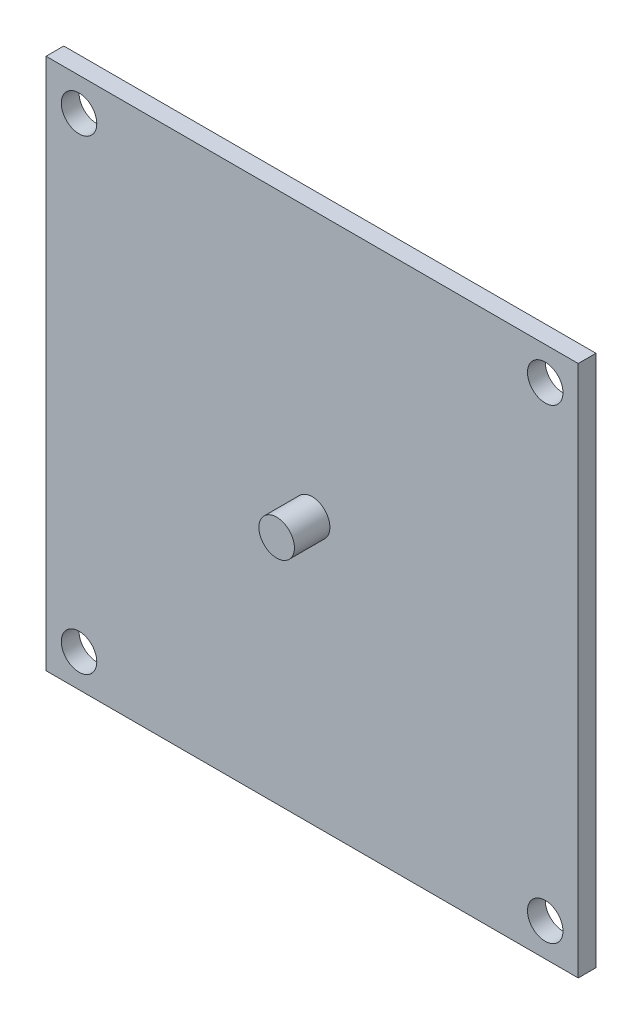
ISO-10303-21;
HEADER;
FILE_DESCRIPTION(('STEP AP214'),'2;1');
FILE_NAME('part.step','',(''),(''),'','','');
FILE_SCHEMA(('AUTOMOTIVE_DESIGN { 1 0 10303 214 1 1 1 1 }'));
ENDSEC;
DATA;
#1=APPLICATION_CONTEXT('core data for automotive mechanical design processes');
#2=APPLICATION_PROTOCOL_DEFINITION('international standard','automotive_design',2000,#1);
#3=PRODUCT_CONTEXT('',#1,'mechanical');
#4=PRODUCT('Part','Part','',(#3));
#5=PRODUCT_RELATED_PRODUCT_CATEGORY('part','',(#4));
#6=PRODUCT_DEFINITION_FORMATION('','',#4);
#7=PRODUCT_DEFINITION_CONTEXT('part definition',#1,'design');
#8=PRODUCT_DEFINITION('design','',#6,#7);
#9=PRODUCT_DEFINITION_SHAPE('','',#8);
#10=(LENGTH_UNIT() NAMED_UNIT(*) SI_UNIT(.MILLI.,.METRE.));
#11=(NAMED_UNIT(*) PLANE_ANGLE_UNIT() SI_UNIT($,.RADIAN.));
#12=(NAMED_UNIT(*) SI_UNIT($,.STERADIAN.) SOLID_ANGLE_UNIT());
#13=UNCERTAINTY_MEASURE_WITH_UNIT(LENGTH_MEASURE(1.E-05),#10,'distance_accuracy_value','');
#14=(GEOMETRIC_REPRESENTATION_CONTEXT(3) GLOBAL_UNCERTAINTY_ASSIGNED_CONTEXT((#13)) GLOBAL_UNIT_ASSIGNED_CONTEXT((#10,
#11,#12)) REPRESENTATION_CONTEXT('',''));
#15=CARTESIAN_POINT('',(0.,0.,0.));
#16=DIRECTION('',(0.,0.,1.));
#17=DIRECTION('',(1.,0.,0.));
#18=AXIS2_PLACEMENT_3D('',#15,#16,#17);
#19=CARTESIAN_POINT('',(15.,15.,1.));
#20=DIRECTION('',(-1.,0.,0.));
#21=DIRECTION('',(0.,-1.,0.));
#22=AXIS2_PLACEMENT_3D('',#19,#20,#21);
#23=PLANE('',#22);
#24=DIRECTION('',(0.,1.,0.));
#25=VECTOR('',#24,1.);
#26=CARTESIAN_POINT('',(15.,15.,0.));
#27=LINE('',#26,#25);
#28=CARTESIAN_POINT('',(15.,-15.,0.));
#29=VERTEX_POINT('',#28);
#30=CARTESIAN_POINT('',(15.,15.,0.));
#31=VERTEX_POINT('',#30);
#32=EDGE_CURVE('E97',#29,#31,#27,.T.);
#33=ORIENTED_EDGE('',*,*,#32,.T.);
#34=DIRECTION('',(0.,0.,-1.));
#35=VECTOR('',#34,1.);
#36=CARTESIAN_POINT('',(15.,15.,1.));
#37=LINE('',#36,#35);
#38=CARTESIAN_POINT('',(15.,15.,1.));
#39=VERTEX_POINT('',#38);
#40=EDGE_CURVE('E11',#39,#31,#37,.T.);
#41=ORIENTED_EDGE('',*,*,#40,.F.);
#42=DIRECTION('',(0.,1.,0.));
#43=VECTOR('',#42,1.);
#44=CARTESIAN_POINT('',(15.,15.,1.));
#45=LINE('',#44,#43);
#46=CARTESIAN_POINT('',(15.,-15.,1.));
#47=VERTEX_POINT('',#46);
#48=EDGE_CURVE('E85',#47,#39,#45,.T.);
#49=ORIENTED_EDGE('',*,*,#48,.F.);
#50=DIRECTION('',(0.,0.,-1.));
#51=VECTOR('',#50,1.);
#52=CARTESIAN_POINT('',(15.,-15.,1.));
#53=LINE('',#52,#51);
#54=EDGE_CURVE('E93',#47,#29,#53,.T.);
#55=ORIENTED_EDGE('',*,*,#54,.T.);
#56=EDGE_LOOP('',(#33,#41,#49,#55));
#57=FACE_BOUND('',#56,.T.);
#58=ADVANCED_FACE('F34',(#57),#23,.F.);
#59=CARTESIAN_POINT('',(-15.,15.,1.));
#60=DIRECTION('',(0.,-1.,0.));
#61=DIRECTION('',(0.,0.,-1.));
#62=AXIS2_PLACEMENT_3D('',#59,#60,#61);
#63=PLANE('',#62);
#64=DIRECTION('',(-1.,0.,0.));
#65=VECTOR('',#64,1.);
#66=CARTESIAN_POINT('',(-15.,15.,0.));
#67=LINE('',#66,#65);
#68=CARTESIAN_POINT('',(-15.,15.,0.));
#69=VERTEX_POINT('',#68);
#70=EDGE_CURVE('E89',#31,#69,#67,.T.);
#71=ORIENTED_EDGE('',*,*,#70,.T.);
#72=DIRECTION('',(0.,0.,-1.));
#73=VECTOR('',#72,1.);
#74=CARTESIAN_POINT('',(-15.,15.,1.));
#75=LINE('',#74,#73);
#76=CARTESIAN_POINT('',(-15.,15.,1.));
#77=VERTEX_POINT('',#76);
#78=EDGE_CURVE('E42',#77,#69,#75,.T.);
#79=ORIENTED_EDGE('',*,*,#78,.F.);
#80=DIRECTION('',(-1.,0.,0.));
#81=VECTOR('',#80,1.);
#82=CARTESIAN_POINT('',(-15.,15.,1.));
#83=LINE('',#82,#81);
#84=EDGE_CURVE('E80',#39,#77,#83,.T.);
#85=ORIENTED_EDGE('',*,*,#84,.F.);
#86=ORIENTED_EDGE('',*,*,#40,.T.);
#87=EDGE_LOOP('',(#71,#79,#85,#86));
#88=FACE_BOUND('',#87,.T.);
#89=ADVANCED_FACE('F88',(#88),#63,.F.);
#90=CARTESIAN_POINT('',(-15.,15.,1.));
#91=DIRECTION('',(1.,0.,0.));
#92=DIRECTION('',(0.,1.,0.));
#93=AXIS2_PLACEMENT_3D('',#90,#91,#92);
#94=PLANE('',#93);
#95=DIRECTION('',(0.,-1.,0.));
#96=VECTOR('',#95,1.);
#97=CARTESIAN_POINT('',(-15.,15.,0.));
#98=LINE('',#97,#96);
#99=CARTESIAN_POINT('',(-15.,-15.,0.));
#100=VERTEX_POINT('',#99);
#101=EDGE_CURVE('E67',#69,#100,#98,.T.);
#102=ORIENTED_EDGE('',*,*,#101,.T.);
#103=DIRECTION('',(0.,0.,-1.));
#104=VECTOR('',#103,1.);
#105=CARTESIAN_POINT('',(-15.,-15.,1.));
#106=LINE('',#105,#104);
#107=CARTESIAN_POINT('',(-15.,-15.,1.));
#108=VERTEX_POINT('',#107);
#109=EDGE_CURVE('E90',#108,#100,#106,.T.);
#110=ORIENTED_EDGE('',*,*,#109,.F.);
#111=DIRECTION('',(0.,-1.,0.));
#112=VECTOR('',#111,1.);
#113=CARTESIAN_POINT('',(-15.,15.,1.));
#114=LINE('',#113,#112);
#115=EDGE_CURVE('E83',#77,#108,#114,.T.);
#116=ORIENTED_EDGE('',*,*,#115,.F.);
#117=ORIENTED_EDGE('',*,*,#78,.T.);
#118=EDGE_LOOP('',(#102,#110,#116,#117));
#119=FACE_BOUND('',#118,.T.);
#120=ADVANCED_FACE('F91',(#119),#94,.F.);
#121=CARTESIAN_POINT('',(-15.,-15.,1.));
#122=DIRECTION('',(0.,1.,0.));
#123=DIRECTION('',(0.,0.,1.));
#124=AXIS2_PLACEMENT_3D('',#121,#122,#123);
#125=PLANE('',#124);
#126=DIRECTION('',(1.,0.,0.));
#127=VECTOR('',#126,1.);
#128=CARTESIAN_POINT('',(-15.,-15.,0.));
#129=LINE('',#128,#127);
#130=EDGE_CURVE('E73',#100,#29,#129,.T.);
#131=ORIENTED_EDGE('',*,*,#130,.T.);
#132=ORIENTED_EDGE('',*,*,#54,.F.);
#133=DIRECTION('',(1.,0.,0.));
#134=VECTOR('',#133,1.);
#135=CARTESIAN_POINT('',(-15.,-15.,1.));
#136=LINE('',#135,#134);
#137=EDGE_CURVE('E50',#108,#47,#136,.T.);
#138=ORIENTED_EDGE('',*,*,#137,.F.);
#139=ORIENTED_EDGE('',*,*,#109,.T.);
#140=EDGE_LOOP('',(#131,#132,#138,#139));
#141=FACE_BOUND('',#140,.T.);
#142=ADVANCED_FACE('F105',(#141),#125,.F.);
#143=CARTESIAN_POINT('',(0.,0.,1.));
#144=DIRECTION('',(0.,0.,1.));
#145=DIRECTION('',(1.,0.,0.));
#146=AXIS2_PLACEMENT_3D('',#143,#144,#145);
#147=PLANE('',#146);
#148=CARTESIAN_POINT('',(0.,0.,1.));
#149=DIRECTION('',(0.,0.,1.));
#150=DIRECTION('',(1.,0.,0.));
#151=AXIS2_PLACEMENT_3D('',#148,#149,#150);
#152=CIRCLE('',#151,1.);
#153=CARTESIAN_POINT('',(1.,0.,1.));
#154=VERTEX_POINT('',#153);
#155=EDGE_CURVE('E135',#154,#154,#152,.T.);
#156=ORIENTED_EDGE('',*,*,#155,.F.);
#157=EDGE_LOOP('',(#156));
#158=FACE_BOUND('',#157,.T.);
#159=CARTESIAN_POINT('',(-13.1399999999993,-13.14,1.));
#160=DIRECTION('',(0.,0.,1.));
#161=DIRECTION('',(1.,0.,0.));
#162=AXIS2_PLACEMENT_3D('',#159,#160,#161);
#163=CIRCLE('',#162,1.00000000000039);
#164=CARTESIAN_POINT('',(-12.1399999999989,-13.14,1.));
#165=VERTEX_POINT('',#164);
#166=EDGE_CURVE('E117',#165,#165,#163,.T.);
#167=ORIENTED_EDGE('',*,*,#166,.F.);
#168=EDGE_LOOP('',(#167));
#169=FACE_BOUND('',#168,.T.);
#170=CARTESIAN_POINT('',(13.1400000000007,-13.1399999999993,1.));
#171=DIRECTION('',(0.,0.,1.));
#172=DIRECTION('',(1.,0.,0.));
#173=AXIS2_PLACEMENT_3D('',#170,#171,#172);
#174=CIRCLE('',#173,1.00000000000104);
#175=CARTESIAN_POINT('',(14.1400000000018,-13.1399999999993,1.));
#176=VERTEX_POINT('',#175);
#177=EDGE_CURVE('E124',#176,#176,#174,.T.);
#178=ORIENTED_EDGE('',*,*,#177,.F.);
#179=EDGE_LOOP('',(#178));
#180=FACE_BOUND('',#179,.T.);
#181=CARTESIAN_POINT('',(13.14,13.1400000000007,1.));
#182=DIRECTION('',(0.,0.,1.));
#183=DIRECTION('',(1.,0.,0.));
#184=AXIS2_PLACEMENT_3D('',#181,#182,#183);
#185=CIRCLE('',#184,1.00000000000077);
#186=CARTESIAN_POINT('',(14.1400000000008,13.1400000000007,1.));
#187=VERTEX_POINT('',#186);
#188=EDGE_CURVE('E130',#187,#187,#185,.T.);
#189=ORIENTED_EDGE('',*,*,#188,.F.);
#190=EDGE_LOOP('',(#189));
#191=FACE_BOUND('',#190,.T.);
#192=CARTESIAN_POINT('',(-13.14,13.14,1.));
#193=DIRECTION('',(0.,0.,1.));
#194=DIRECTION('',(1.,0.,0.));
#195=AXIS2_PLACEMENT_3D('',#192,#193,#194);
#196=CIRCLE('',#195,1.);
#197=CARTESIAN_POINT('',(-12.14,13.14,1.));
#198=VERTEX_POINT('',#197);
#199=EDGE_CURVE('E111',#198,#198,#196,.T.);
#200=ORIENTED_EDGE('',*,*,#199,.F.);
#201=EDGE_LOOP('',(#200));
#202=FACE_BOUND('',#201,.T.);
#203=ORIENTED_EDGE('',*,*,#48,.T.);
#204=ORIENTED_EDGE('',*,*,#84,.T.);
#205=ORIENTED_EDGE('',*,*,#115,.T.);
#206=ORIENTED_EDGE('',*,*,#137,.T.);
#207=EDGE_LOOP('',(#203,#204,#205,#206));
#208=FACE_BOUND('',#207,.T.);
#209=ADVANCED_FACE('F81',(#158,#169,#180,#191,#202,#208),#147,.T.);
#210=CARTESIAN_POINT('',(0.,0.,0.));
#211=DIRECTION('',(0.,0.,1.));
#212=DIRECTION('',(1.,0.,0.));
#213=AXIS2_PLACEMENT_3D('',#210,#211,#212);
#214=PLANE('',#213);
#215=CARTESIAN_POINT('',(-13.1399999999993,-13.14,0.));
#216=DIRECTION('',(0.,0.,1.));
#217=DIRECTION('',(1.,0.,0.));
#218=AXIS2_PLACEMENT_3D('',#215,#216,#217);
#219=CIRCLE('',#218,1.00000000000039);
#220=CARTESIAN_POINT('',(-12.1399999999989,-13.14,0.));
#221=VERTEX_POINT('',#220);
#222=EDGE_CURVE('E120',#221,#221,#219,.T.);
#223=ORIENTED_EDGE('',*,*,#222,.T.);
#224=EDGE_LOOP('',(#223));
#225=FACE_BOUND('',#224,.T.);
#226=CARTESIAN_POINT('',(13.1400000000007,-13.1399999999993,0.));
#227=DIRECTION('',(0.,0.,1.));
#228=DIRECTION('',(1.,0.,0.));
#229=AXIS2_PLACEMENT_3D('',#226,#227,#228);
#230=CIRCLE('',#229,1.00000000000104);
#231=CARTESIAN_POINT('',(14.1400000000018,-13.1399999999993,0.));
#232=VERTEX_POINT('',#231);
#233=EDGE_CURVE('E127',#232,#232,#230,.T.);
#234=ORIENTED_EDGE('',*,*,#233,.T.);
#235=EDGE_LOOP('',(#234));
#236=FACE_BOUND('',#235,.T.);
#237=CARTESIAN_POINT('',(13.14,13.1400000000007,0.));
#238=DIRECTION('',(0.,0.,1.));
#239=DIRECTION('',(1.,0.,0.));
#240=AXIS2_PLACEMENT_3D('',#237,#238,#239);
#241=CIRCLE('',#240,1.00000000000077);
#242=CARTESIAN_POINT('',(14.1400000000008,13.1400000000007,0.));
#243=VERTEX_POINT('',#242);
#244=EDGE_CURVE('E114',#243,#243,#241,.T.);
#245=ORIENTED_EDGE('',*,*,#244,.T.);
#246=EDGE_LOOP('',(#245));
#247=FACE_BOUND('',#246,.T.);
#248=CARTESIAN_POINT('',(-13.14,13.14,0.));
#249=DIRECTION('',(0.,0.,1.));
#250=DIRECTION('',(1.,0.,0.));
#251=AXIS2_PLACEMENT_3D('',#248,#249,#250);
#252=CIRCLE('',#251,1.);
#253=CARTESIAN_POINT('',(-12.14,13.14,0.));
#254=VERTEX_POINT('',#253);
#255=EDGE_CURVE('E100',#254,#254,#252,.T.);
#256=ORIENTED_EDGE('',*,*,#255,.T.);
#257=EDGE_LOOP('',(#256));
#258=FACE_BOUND('',#257,.T.);
#259=ORIENTED_EDGE('',*,*,#32,.F.);
#260=ORIENTED_EDGE('',*,*,#130,.F.);
#261=ORIENTED_EDGE('',*,*,#101,.F.);
#262=ORIENTED_EDGE('',*,*,#70,.F.);
#263=EDGE_LOOP('',(#259,#260,#261,#262));
#264=FACE_BOUND('',#263,.T.);
#265=ADVANCED_FACE('F108',(#225,#236,#247,#258,#264),#214,.F.);
#266=CARTESIAN_POINT('',(-13.14,13.14,0.));
#267=DIRECTION('',(0.,0.,1.));
#268=DIRECTION('',(1.,0.,0.));
#269=AXIS2_PLACEMENT_3D('',#266,#267,#268);
#270=CYLINDRICAL_SURFACE('',#269,1.);
#271=ORIENTED_EDGE('',*,*,#255,.F.);
#272=EDGE_LOOP('',(#271));
#273=FACE_BOUND('',#272,.T.);
#274=ORIENTED_EDGE('',*,*,#199,.T.);
#275=EDGE_LOOP('',(#274));
#276=FACE_BOUND('',#275,.T.);
#277=ADVANCED_FACE('F161',(#273,#276),#270,.F.);
#278=CARTESIAN_POINT('',(13.14,13.1400000000007,0.));
#279=DIRECTION('',(0.,0.,1.));
#280=DIRECTION('',(1.,0.,0.));
#281=AXIS2_PLACEMENT_3D('',#278,#279,#280);
#282=CYLINDRICAL_SURFACE('',#281,1.00000000000077);
#283=ORIENTED_EDGE('',*,*,#244,.F.);
#284=EDGE_LOOP('',(#283));
#285=FACE_BOUND('',#284,.T.);
#286=ORIENTED_EDGE('',*,*,#188,.T.);
#287=EDGE_LOOP('',(#286));
#288=FACE_BOUND('',#287,.T.);
#289=ADVANCED_FACE('F163',(#285,#288),#282,.F.);
#290=CARTESIAN_POINT('',(13.1400000000007,-13.1399999999993,0.));
#291=DIRECTION('',(0.,0.,1.));
#292=DIRECTION('',(1.,0.,0.));
#293=AXIS2_PLACEMENT_3D('',#290,#291,#292);
#294=CYLINDRICAL_SURFACE('',#293,1.00000000000104);
#295=ORIENTED_EDGE('',*,*,#233,.F.);
#296=EDGE_LOOP('',(#295));
#297=FACE_BOUND('',#296,.T.);
#298=ORIENTED_EDGE('',*,*,#177,.T.);
#299=EDGE_LOOP('',(#298));
#300=FACE_BOUND('',#299,.T.);
#301=ADVANCED_FACE('F170',(#297,#300),#294,.F.);
#302=CARTESIAN_POINT('',(-13.1399999999993,-13.14,0.));
#303=DIRECTION('',(0.,0.,1.));
#304=DIRECTION('',(1.,0.,0.));
#305=AXIS2_PLACEMENT_3D('',#302,#303,#304);
#306=CYLINDRICAL_SURFACE('',#305,1.00000000000039);
#307=ORIENTED_EDGE('',*,*,#222,.F.);
#308=EDGE_LOOP('',(#307));
#309=FACE_BOUND('',#308,.T.);
#310=ORIENTED_EDGE('',*,*,#166,.T.);
#311=EDGE_LOOP('',(#310));
#312=FACE_BOUND('',#311,.T.);
#313=ADVANCED_FACE('F146',(#309,#312),#306,.F.);
#314=CARTESIAN_POINT('',(0.,0.,3.));
#315=DIRECTION('',(0.,0.,-1.));
#316=DIRECTION('',(-1.,0.,0.));
#317=AXIS2_PLACEMENT_3D('',#314,#315,#316);
#318=CYLINDRICAL_SURFACE('',#317,1.);
#319=CARTESIAN_POINT('',(0.,0.,3.));
#320=DIRECTION('',(0.,0.,1.));
#321=DIRECTION('',(1.,0.,0.));
#322=AXIS2_PLACEMENT_3D('',#319,#320,#321);
#323=CIRCLE('',#322,1.);
#324=CARTESIAN_POINT('',(1.,0.,3.));
#325=VERTEX_POINT('',#324);
#326=EDGE_CURVE('E121',#325,#325,#323,.T.);
#327=ORIENTED_EDGE('',*,*,#326,.F.);
#328=EDGE_LOOP('',(#327));
#329=FACE_BOUND('',#328,.T.);
#330=ORIENTED_EDGE('',*,*,#155,.T.);
#331=EDGE_LOOP('',(#330));
#332=FACE_BOUND('',#331,.T.);
#333=ADVANCED_FACE('F143',(#329,#332),#318,.T.);
#334=CARTESIAN_POINT('',(0.,0.,3.));
#335=DIRECTION('',(0.,0.,1.));
#336=DIRECTION('',(1.,0.,0.));
#337=AXIS2_PLACEMENT_3D('',#334,#335,#336);
#338=PLANE('',#337);
#339=ORIENTED_EDGE('',*,*,#326,.T.);
#340=EDGE_LOOP('',(#339));
#341=FACE_BOUND('',#340,.T.);
#342=ADVANCED_FACE('F141',(#341),#338,.T.);
#343=CLOSED_SHELL('',(#58,#89,#120,#142,#209,#265,#277,#289,#301,#313,#333,#342));
#344=MANIFOLD_SOLID_BREP('B2',#343);
#345=ADVANCED_BREP_SHAPE_REPRESENTATION('',(#18,#344),#14);
#346=SHAPE_DEFINITION_REPRESENTATION(#9,#345);
ENDSEC;
END-ISO-10303-21;
